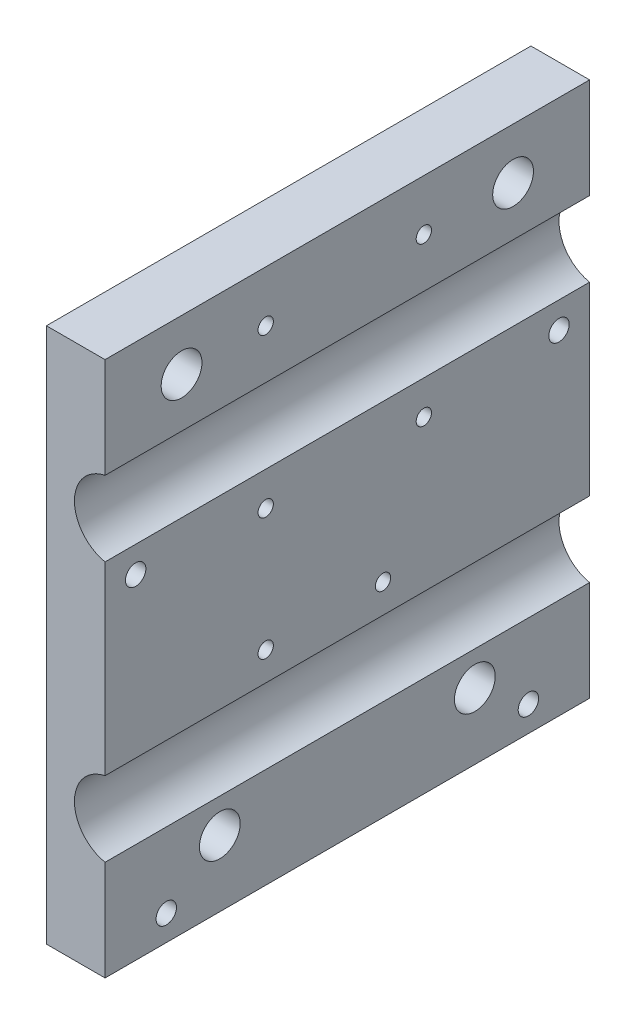
ISO-10303-21;
HEADER;
FILE_DESCRIPTION(('STEP AP214'),'2;1');
FILE_NAME('part.step','',(''),(''),'','','');
FILE_SCHEMA(('AUTOMOTIVE_DESIGN { 1 0 10303 214 1 1 1 1 }'));
ENDSEC;
DATA;
#1=APPLICATION_CONTEXT('core data for automotive mechanical design processes');
#2=APPLICATION_PROTOCOL_DEFINITION('international standard','automotive_design',2000,#1);
#3=PRODUCT_CONTEXT('',#1,'mechanical');
#4=PRODUCT('Part','Part','',(#3));
#5=PRODUCT_RELATED_PRODUCT_CATEGORY('part','',(#4));
#6=PRODUCT_DEFINITION_FORMATION('','',#4);
#7=PRODUCT_DEFINITION_CONTEXT('part definition',#1,'design');
#8=PRODUCT_DEFINITION('design','',#6,#7);
#9=PRODUCT_DEFINITION_SHAPE('','',#8);
#10=(LENGTH_UNIT() NAMED_UNIT(*) SI_UNIT(.MILLI.,.METRE.));
#11=(NAMED_UNIT(*) PLANE_ANGLE_UNIT() SI_UNIT($,.RADIAN.));
#12=(NAMED_UNIT(*) SI_UNIT($,.STERADIAN.) SOLID_ANGLE_UNIT());
#13=UNCERTAINTY_MEASURE_WITH_UNIT(LENGTH_MEASURE(1.E-05),#10,'distance_accuracy_value','');
#14=(GEOMETRIC_REPRESENTATION_CONTEXT(3) GLOBAL_UNCERTAINTY_ASSIGNED_CONTEXT((#13)) GLOBAL_UNIT_ASSIGNED_CONTEXT((#10,
#11,#12)) REPRESENTATION_CONTEXT('',''));
#15=CARTESIAN_POINT('',(0.,0.,0.));
#16=DIRECTION('',(0.,0.,1.));
#17=DIRECTION('',(1.,0.,0.));
#18=AXIS2_PLACEMENT_3D('',#15,#16,#17);
#19=CARTESIAN_POINT('',(-11.5,2.77555756156289E-13,95.0000000000002));
#20=DIRECTION('',(1.,0.,0.));
#21=DIRECTION('',(0.,0.,-1.));
#22=AXIS2_PLACEMENT_3D('',#19,#20,#21);
#23=PLANE('',#22);
#24=CARTESIAN_POINT('',(-11.4999999999995,-9.99999999999995,63.5000000000001));
#25=DIRECTION('',(1.,0.,0.));
#26=DIRECTION('',(0.,1.,0.));
#27=AXIS2_PLACEMENT_3D('',#24,#25,#26);
#28=CIRCLE('',#27,1.5);
#29=CARTESIAN_POINT('',(-11.4999999999995,-8.49999999999996,63.5000000000001));
#30=VERTEX_POINT('',#29);
#31=EDGE_CURVE('E229',#30,#30,#28,.T.);
#32=ORIENTED_EDGE('',*,*,#31,.T.);
#33=EDGE_LOOP('',(#32));
#34=FACE_BOUND('',#33,.T.);
#35=CARTESIAN_POINT('',(-11.4999999999995,-41.0000000000002,63.5000000000001));
#36=DIRECTION('',(1.,0.,0.));
#37=DIRECTION('',(0.,1.,0.));
#38=AXIS2_PLACEMENT_3D('',#35,#36,#37);
#39=CIRCLE('',#38,1.5);
#40=CARTESIAN_POINT('',(-11.4999999999995,-39.5000000000002,63.5000000000001));
#41=VERTEX_POINT('',#40);
#42=EDGE_CURVE('E254',#41,#41,#39,.T.);
#43=ORIENTED_EDGE('',*,*,#42,.T.);
#44=EDGE_LOOP('',(#43));
#45=FACE_BOUND('',#44,.T.);
#46=CARTESIAN_POINT('',(-11.4999999999995,-41.,32.5));
#47=DIRECTION('',(1.,0.,0.));
#48=DIRECTION('',(0.,1.,0.));
#49=AXIS2_PLACEMENT_3D('',#46,#47,#48);
#50=CIRCLE('',#49,1.5);
#51=CARTESIAN_POINT('',(-11.4999999999995,-39.5,32.5));
#52=VERTEX_POINT('',#51);
#53=EDGE_CURVE('E246',#52,#52,#50,.T.);
#54=ORIENTED_EDGE('',*,*,#53,.T.);
#55=EDGE_LOOP('',(#54));
#56=FACE_BOUND('',#55,.T.);
#57=CARTESIAN_POINT('',(-11.4999999999995,-65.,40.5));
#58=DIRECTION('',(1.,0.,0.));
#59=DIRECTION('',(0.,1.,0.));
#60=AXIS2_PLACEMENT_3D('',#57,#58,#59);
#61=CIRCLE('',#60,1.5);
#62=CARTESIAN_POINT('',(-11.4999999999995,-63.5,40.5));
#63=VERTEX_POINT('',#62);
#64=EDGE_CURVE('E237',#63,#63,#61,.T.);
#65=ORIENTED_EDGE('',*,*,#64,.T.);
#66=EDGE_LOOP('',(#65));
#67=FACE_BOUND('',#66,.T.);
#68=CARTESIAN_POINT('',(-11.4999999999995,-65.0000000000002,63.5));
#69=DIRECTION('',(1.,0.,0.));
#70=DIRECTION('',(0.,1.,0.));
#71=AXIS2_PLACEMENT_3D('',#68,#69,#70);
#72=CIRCLE('',#71,1.5);
#73=CARTESIAN_POINT('',(-11.4999999999995,-63.5000000000002,63.5));
#74=VERTEX_POINT('',#73);
#75=EDGE_CURVE('E238',#74,#74,#72,.T.);
#76=ORIENTED_EDGE('',*,*,#75,.T.);
#77=EDGE_LOOP('',(#76));
#78=FACE_BOUND('',#77,.T.);
#79=CARTESIAN_POINT('',(-11.4999999999995,-10.,32.5000000000001));
#80=DIRECTION('',(1.,0.,0.));
#81=DIRECTION('',(0.,1.,0.));
#82=AXIS2_PLACEMENT_3D('',#79,#80,#81);
#83=CIRCLE('',#82,1.5);
#84=CARTESIAN_POINT('',(-11.4999999999995,-8.50000000000001,32.5000000000001));
#85=VERTEX_POINT('',#84);
#86=EDGE_CURVE('E221',#85,#85,#83,.T.);
#87=ORIENTED_EDGE('',*,*,#86,.T.);
#88=EDGE_LOOP('',(#87));
#89=FACE_BOUND('',#88,.T.);
#90=CARTESIAN_POINT('',(-11.4999999999995,-92.0000000000001,72.5));
#91=DIRECTION('',(-1.,0.,0.));
#92=DIRECTION('',(0.,0.,1.));
#93=AXIS2_PLACEMENT_3D('',#90,#91,#92);
#94=CIRCLE('',#93,4.00000000000001);
#95=CARTESIAN_POINT('',(-11.4999999999995,-92.0000000000001,76.5));
#96=VERTEX_POINT('',#95);
#97=EDGE_CURVE('E210',#96,#96,#94,.T.);
#98=ORIENTED_EDGE('',*,*,#97,.F.);
#99=EDGE_LOOP('',(#98));
#100=FACE_BOUND('',#99,.T.);
#101=CARTESIAN_POINT('',(-11.4999999999994,-10.0000000000005,15.0000000000001));
#102=DIRECTION('',(-1.,0.,0.));
#103=DIRECTION('',(0.,0.,1.));
#104=AXIS2_PLACEMENT_3D('',#101,#102,#103);
#105=CIRCLE('',#104,4.00000000000001);
#106=CARTESIAN_POINT('',(-11.4999999999994,-10.0000000000005,19.0000000000001));
#107=VERTEX_POINT('',#106);
#108=EDGE_CURVE('E201',#107,#107,#105,.T.);
#109=ORIENTED_EDGE('',*,*,#108,.F.);
#110=EDGE_LOOP('',(#109));
#111=FACE_BOUND('',#110,.T.);
#112=CARTESIAN_POINT('',(-11.5,-92.0000000000003,22.5000000000001));
#113=DIRECTION('',(-1.,0.,0.));
#114=DIRECTION('',(0.,0.,1.));
#115=AXIS2_PLACEMENT_3D('',#112,#113,#114);
#116=CIRCLE('',#115,4.00000000000001);
#117=CARTESIAN_POINT('',(-11.5,-92.0000000000003,26.5000000000001));
#118=VERTEX_POINT('',#117);
#119=EDGE_CURVE('E217',#118,#118,#116,.T.);
#120=ORIENTED_EDGE('',*,*,#119,.F.);
#121=EDGE_LOOP('',(#120));
#122=FACE_BOUND('',#121,.T.);
#123=CARTESIAN_POINT('',(-11.5,-9.99999999999973,80.0000000000001));
#124=DIRECTION('',(-1.,0.,0.));
#125=DIRECTION('',(0.,0.,1.));
#126=AXIS2_PLACEMENT_3D('',#123,#124,#125);
#127=CIRCLE('',#126,4.00000000000001);
#128=CARTESIAN_POINT('',(-11.5,-9.99999999999973,84.0000000000001));
#129=VERTEX_POINT('',#128);
#130=EDGE_CURVE('E193',#129,#129,#127,.T.);
#131=ORIENTED_EDGE('',*,*,#130,.F.);
#132=EDGE_LOOP('',(#131));
#133=FACE_BOUND('',#132,.T.);
#134=CARTESIAN_POINT('',(-11.5,-39.4999999999999,6.00000000000006));
#135=DIRECTION('',(1.,0.,0.));
#136=DIRECTION('',(0.,1.,0.));
#137=AXIS2_PLACEMENT_3D('',#134,#135,#136);
#138=CIRCLE('',#137,2.);
#139=CARTESIAN_POINT('',(-11.5,-37.4999999999999,6.00000000000006));
#140=VERTEX_POINT('',#139);
#141=EDGE_CURVE('E164',#140,#140,#138,.T.);
#142=ORIENTED_EDGE('',*,*,#141,.T.);
#143=EDGE_LOOP('',(#142));
#144=FACE_BOUND('',#143,.T.);
#145=CARTESIAN_POINT('',(-11.5,-39.5,89.0000000000001));
#146=DIRECTION('',(1.,0.,0.));
#147=DIRECTION('',(0.,1.,0.));
#148=AXIS2_PLACEMENT_3D('',#145,#146,#147);
#149=CIRCLE('',#148,2.);
#150=CARTESIAN_POINT('',(-11.5,-37.5,89.0000000000001));
#151=VERTEX_POINT('',#150);
#152=EDGE_CURVE('E181',#151,#151,#149,.T.);
#153=ORIENTED_EDGE('',*,*,#152,.T.);
#154=EDGE_LOOP('',(#153));
#155=FACE_BOUND('',#154,.T.);
#156=CARTESIAN_POINT('',(-11.5,-99.9999999999998,12.));
#157=DIRECTION('',(1.,0.,0.));
#158=DIRECTION('',(0.,-1.,0.));
#159=AXIS2_PLACEMENT_3D('',#156,#157,#158);
#160=CIRCLE('',#159,2.);
#161=CARTESIAN_POINT('',(-11.5,-102.,12.));
#162=VERTEX_POINT('',#161);
#163=EDGE_CURVE('E172',#162,#162,#160,.T.);
#164=ORIENTED_EDGE('',*,*,#163,.T.);
#165=EDGE_LOOP('',(#164));
#166=FACE_BOUND('',#165,.T.);
#167=CARTESIAN_POINT('',(-11.4999999999995,-99.9999999999999,83.0000000000003));
#168=DIRECTION('',(1.,0.,0.));
#169=DIRECTION('',(0.,1.,0.));
#170=AXIS2_PLACEMENT_3D('',#167,#168,#169);
#171=CIRCLE('',#170,2.);
#172=CARTESIAN_POINT('',(-11.4999999999995,-97.9999999999999,83.0000000000003));
#173=VERTEX_POINT('',#172);
#174=EDGE_CURVE('E163',#173,#173,#171,.T.);
#175=ORIENTED_EDGE('',*,*,#174,.T.);
#176=EDGE_LOOP('',(#175));
#177=FACE_BOUND('',#176,.T.);
#178=DIRECTION('',(0.,-1.,0.));
#179=VECTOR('',#178,1.);
#180=CARTESIAN_POINT('',(-11.5,0.,0.));
#181=LINE('',#180,#179);
#182=CARTESIAN_POINT('',(-11.5,0.,0.));
#183=VERTEX_POINT('',#182);
#184=CARTESIAN_POINT('',(-11.5,-105.,0.));
#185=VERTEX_POINT('',#184);
#186=EDGE_CURVE('E176',#183,#185,#181,.T.);
#187=ORIENTED_EDGE('',*,*,#186,.T.);
#188=DIRECTION('',(0.,0.,-1.));
#189=VECTOR('',#188,1.);
#190=CARTESIAN_POINT('',(-11.4999999999995,-105.,95.0000000000002));
#191=LINE('',#190,#189);
#192=CARTESIAN_POINT('',(-11.4999999999995,-105.,95.0000000000002));
#193=VERTEX_POINT('',#192);
#194=EDGE_CURVE('E11',#193,#185,#191,.T.);
#195=ORIENTED_EDGE('',*,*,#194,.F.);
#196=DIRECTION('',(0.,-1.,0.));
#197=VECTOR('',#196,1.);
#198=CARTESIAN_POINT('',(-11.5,2.77555756156289E-13,95.0000000000002));
#199=LINE('',#198,#197);
#200=CARTESIAN_POINT('',(-11.5,2.77555756156289E-13,95.0000000000002));
#201=VERTEX_POINT('',#200);
#202=EDGE_CURVE('E156',#201,#193,#199,.T.);
#203=ORIENTED_EDGE('',*,*,#202,.F.);
#204=DIRECTION('',(0.,0.,-1.));
#205=VECTOR('',#204,1.);
#206=CARTESIAN_POINT('',(-11.5,2.77555756156289E-13,95.0000000000002));
#207=LINE('',#206,#205);
#208=EDGE_CURVE('E138',#201,#183,#207,.T.);
#209=ORIENTED_EDGE('',*,*,#208,.T.);
#210=EDGE_LOOP('',(#187,#195,#203,#209));
#211=FACE_BOUND('',#210,.T.);
#212=ADVANCED_FACE('F41',(#34,#45,#56,#67,#78,#89,#100,#111,#122,#133,#144,#155,#166,#177,#211),
#23,.F.);
#213=CARTESIAN_POINT('',(5.55111512312578E-13,-105.,95.));
#214=DIRECTION('',(0.,1.,0.));
#215=DIRECTION('',(0.,0.,1.));
#216=AXIS2_PLACEMENT_3D('',#213,#214,#215);
#217=PLANE('',#216);
#218=DIRECTION('',(1.,0.,0.));
#219=VECTOR('',#218,1.);
#220=CARTESIAN_POINT('',(0.,-105.,0.));
#221=LINE('',#220,#219);
#222=CARTESIAN_POINT('',(0.,-105.,0.));
#223=VERTEX_POINT('',#222);
#224=EDGE_CURVE('E333',#185,#223,#221,.T.);
#225=ORIENTED_EDGE('',*,*,#224,.T.);
#226=DIRECTION('',(0.,0.,-1.));
#227=VECTOR('',#226,1.);
#228=CARTESIAN_POINT('',(5.55111512312578E-13,-105.,95.));
#229=LINE('',#228,#227);
#230=CARTESIAN_POINT('',(5.55111512312578E-13,-105.,95.));
#231=VERTEX_POINT('',#230);
#232=EDGE_CURVE('E50',#231,#223,#229,.T.);
#233=ORIENTED_EDGE('',*,*,#232,.F.);
#234=DIRECTION('',(1.,0.,0.));
#235=VECTOR('',#234,1.);
#236=CARTESIAN_POINT('',(5.55111512312578E-13,-105.,95.));
#237=LINE('',#236,#235);
#238=EDGE_CURVE('E97',#193,#231,#237,.T.);
#239=ORIENTED_EDGE('',*,*,#238,.F.);
#240=ORIENTED_EDGE('',*,*,#194,.T.);
#241=EDGE_LOOP('',(#225,#233,#239,#240));
#242=FACE_BOUND('',#241,.T.);
#243=ADVANCED_FACE('F334',(#242),#217,.F.);
#244=CARTESIAN_POINT('',(0.,2.77555756156289E-13,95.));
#245=DIRECTION('',(1.,0.,0.));
#246=DIRECTION('',(0.,1.,0.));
#247=AXIS2_PLACEMENT_3D('',#244,#245,#246);
#248=PLANE('',#247);
#249=CARTESIAN_POINT('',(5.55111512312578E-13,-92.0000000000001,72.5));
#250=DIRECTION('',(-1.,0.,0.));
#251=DIRECTION('',(0.,0.,1.));
#252=AXIS2_PLACEMENT_3D('',#249,#250,#251);
#253=CIRCLE('',#252,4.00000000000001);
#254=CARTESIAN_POINT('',(5.55111512312578E-13,-92.0000000000001,76.5));
#255=VERTEX_POINT('',#254);
#256=EDGE_CURVE('E197',#255,#255,#253,.T.);
#257=ORIENTED_EDGE('',*,*,#256,.T.);
#258=EDGE_LOOP('',(#257));
#259=FACE_BOUND('',#258,.T.);
#260=CARTESIAN_POINT('',(0.,-92.0000000000003,22.5));
#261=DIRECTION('',(-1.,0.,0.));
#262=DIRECTION('',(0.,0.,1.));
#263=AXIS2_PLACEMENT_3D('',#260,#261,#262);
#264=CIRCLE('',#263,4.00000000000001);
#265=CARTESIAN_POINT('',(0.,-92.0000000000003,26.5));
#266=VERTEX_POINT('',#265);
#267=EDGE_CURVE('E206',#266,#266,#264,.T.);
#268=ORIENTED_EDGE('',*,*,#267,.T.);
#269=EDGE_LOOP('',(#268));
#270=FACE_BOUND('',#269,.T.);
#271=CARTESIAN_POINT('',(0.,-99.9999999999998,12.));
#272=DIRECTION('',(1.,0.,0.));
#273=DIRECTION('',(0.,-1.,0.));
#274=AXIS2_PLACEMENT_3D('',#271,#272,#273);
#275=CIRCLE('',#274,2.);
#276=CARTESIAN_POINT('',(0.,-102.,12.));
#277=VERTEX_POINT('',#276);
#278=EDGE_CURVE('E168',#277,#277,#275,.T.);
#279=ORIENTED_EDGE('',*,*,#278,.F.);
#280=EDGE_LOOP('',(#279));
#281=FACE_BOUND('',#280,.T.);
#282=CARTESIAN_POINT('',(5.55111512312578E-13,-99.9999999999999,83.));
#283=DIRECTION('',(1.,0.,0.));
#284=DIRECTION('',(0.,1.,0.));
#285=AXIS2_PLACEMENT_3D('',#282,#283,#284);
#286=CIRCLE('',#285,2.);
#287=CARTESIAN_POINT('',(5.53731443413912E-13,-97.9999999999999,83.));
#288=VERTEX_POINT('',#287);
#289=EDGE_CURVE('E159',#288,#288,#286,.T.);
#290=ORIENTED_EDGE('',*,*,#289,.F.);
#291=EDGE_LOOP('',(#290));
#292=FACE_BOUND('',#291,.T.);
#293=DIRECTION('',(0.,-1.,0.));
#294=VECTOR('',#293,1.);
#295=CARTESIAN_POINT('',(0.,0.,0.));
#296=LINE('',#295,#294);
#297=CARTESIAN_POINT('',(0.,-85.3484692283494,0.));
#298=VERTEX_POINT('',#297);
#299=EDGE_CURVE('E331',#298,#223,#296,.T.);
#300=ORIENTED_EDGE('',*,*,#299,.F.);
#301=DIRECTION('',(0.,0.,-1.));
#302=VECTOR('',#301,1.);
#303=CARTESIAN_POINT('',(5.55111512312578E-13,-85.3484692283495,95.));
#304=LINE('',#303,#302);
#305=CARTESIAN_POINT('',(5.55111512312578E-13,-85.3484692283495,95.));
#306=VERTEX_POINT('',#305);
#307=EDGE_CURVE('E322',#306,#298,#304,.T.);
#308=ORIENTED_EDGE('',*,*,#307,.F.);
#309=DIRECTION('',(0.,-1.,0.));
#310=VECTOR('',#309,1.);
#311=CARTESIAN_POINT('',(0.,2.77555756156289E-13,95.));
#312=LINE('',#311,#310);
#313=EDGE_CURVE('E147',#306,#231,#312,.T.);
#314=ORIENTED_EDGE('',*,*,#313,.T.);
#315=ORIENTED_EDGE('',*,*,#232,.T.);
#316=EDGE_LOOP('',(#300,#308,#314,#315));
#317=FACE_BOUND('',#316,.T.);
#318=ADVANCED_FACE('F329',(#259,#270,#281,#292,#317),#248,.T.);
#319=CARTESIAN_POINT('',(1.5000000000005,-78.,95.));
#320=DIRECTION('',(0.,0.,-1.));
#321=DIRECTION('',(-1.,0.,0.));
#322=AXIS2_PLACEMENT_3D('',#319,#320,#321);
#323=CYLINDRICAL_SURFACE('',#322,7.50000000000002);
#324=CARTESIAN_POINT('',(1.50000000000006,-77.9999999999998,0.));
#325=DIRECTION('',(0.,0.,1.));
#326=DIRECTION('',(1.,0.,0.));
#327=AXIS2_PLACEMENT_3D('',#324,#325,#326);
#328=CIRCLE('',#327,7.50000000000002);
#329=CARTESIAN_POINT('',(0.,-70.6515307716503,0.));
#330=VERTEX_POINT('',#329);
#331=EDGE_CURVE('E301',#330,#298,#328,.T.);
#332=ORIENTED_EDGE('',*,*,#331,.F.);
#333=DIRECTION('',(0.,0.,-1.));
#334=VECTOR('',#333,1.);
#335=CARTESIAN_POINT('',(5.55111512312578E-13,-70.6515307716504,95.));
#336=LINE('',#335,#334);
#337=CARTESIAN_POINT('',(5.55111512312578E-13,-70.6515307716504,95.));
#338=VERTEX_POINT('',#337);
#339=EDGE_CURVE('E296',#338,#330,#336,.T.);
#340=ORIENTED_EDGE('',*,*,#339,.F.);
#341=CARTESIAN_POINT('',(1.5000000000005,-78.,95.));
#342=DIRECTION('',(0.,0.,1.));
#343=DIRECTION('',(1.,0.,0.));
#344=AXIS2_PLACEMENT_3D('',#341,#342,#343);
#345=CIRCLE('',#344,7.50000000000002);
#346=EDGE_CURVE('E142',#338,#306,#345,.T.);
#347=ORIENTED_EDGE('',*,*,#346,.T.);
#348=ORIENTED_EDGE('',*,*,#307,.T.);
#349=EDGE_LOOP('',(#332,#340,#347,#348));
#350=FACE_BOUND('',#349,.T.);
#351=ADVANCED_FACE('F287',(#350),#323,.F.);
#352=CARTESIAN_POINT('',(0.,2.77555756156289E-13,95.));
#353=DIRECTION('',(1.,0.,0.));
#354=DIRECTION('',(0.,1.,0.));
#355=AXIS2_PLACEMENT_3D('',#352,#353,#354);
#356=PLANE('',#355);
#357=CARTESIAN_POINT('',(5.55111512312578E-13,-41.0000000000002,63.5));
#358=DIRECTION('',(1.,0.,0.));
#359=DIRECTION('',(0.,1.,0.));
#360=AXIS2_PLACEMENT_3D('',#357,#358,#359);
#361=CIRCLE('',#360,1.5);
#362=CARTESIAN_POINT('',(5.54278845044109E-13,-39.5000000000002,63.5));
#363=VERTEX_POINT('',#362);
#364=EDGE_CURVE('E250',#363,#363,#361,.T.);
#365=ORIENTED_EDGE('',*,*,#364,.F.);
#366=EDGE_LOOP('',(#365));
#367=FACE_BOUND('',#366,.T.);
#368=CARTESIAN_POINT('',(5.55111512312578E-13,-40.9999999999999,32.5));
#369=DIRECTION('',(1.,0.,0.));
#370=DIRECTION('',(0.,1.,0.));
#371=AXIS2_PLACEMENT_3D('',#368,#369,#370);
#372=CIRCLE('',#371,1.5);
#373=CARTESIAN_POINT('',(5.54278845044109E-13,-39.4999999999999,32.5));
#374=VERTEX_POINT('',#373);
#375=EDGE_CURVE('E242',#374,#374,#372,.T.);
#376=ORIENTED_EDGE('',*,*,#375,.F.);
#377=EDGE_LOOP('',(#376));
#378=FACE_BOUND('',#377,.T.);
#379=CARTESIAN_POINT('',(5.55111512312578E-13,-65.,40.5));
#380=DIRECTION('',(1.,0.,0.));
#381=DIRECTION('',(0.,1.,0.));
#382=AXIS2_PLACEMENT_3D('',#379,#380,#381);
#383=CIRCLE('',#382,1.5);
#384=CARTESIAN_POINT('',(5.54278845044109E-13,-63.5,40.5));
#385=VERTEX_POINT('',#384);
#386=EDGE_CURVE('E233',#385,#385,#383,.T.);
#387=ORIENTED_EDGE('',*,*,#386,.F.);
#388=EDGE_LOOP('',(#387));
#389=FACE_BOUND('',#388,.T.);
#390=CARTESIAN_POINT('',(5.55111512312578E-13,-65.0000000000002,63.5));
#391=DIRECTION('',(1.,0.,0.));
#392=DIRECTION('',(0.,1.,0.));
#393=AXIS2_PLACEMENT_3D('',#390,#391,#392);
#394=CIRCLE('',#393,1.5);
#395=CARTESIAN_POINT('',(5.54278845044109E-13,-63.5000000000002,63.5));
#396=VERTEX_POINT('',#395);
#397=EDGE_CURVE('E265',#396,#396,#394,.T.);
#398=ORIENTED_EDGE('',*,*,#397,.F.);
#399=EDGE_LOOP('',(#398));
#400=FACE_BOUND('',#399,.T.);
#401=CARTESIAN_POINT('',(0.,-39.4999999999999,6.00000000000001));
#402=DIRECTION('',(1.,0.,0.));
#403=DIRECTION('',(0.,1.,0.));
#404=AXIS2_PLACEMENT_3D('',#401,#402,#403);
#405=CIRCLE('',#404,2.);
#406=CARTESIAN_POINT('',(0.,-37.4999999999999,6.00000000000001));
#407=VERTEX_POINT('',#406);
#408=EDGE_CURVE('E186',#407,#407,#405,.T.);
#409=ORIENTED_EDGE('',*,*,#408,.F.);
#410=EDGE_LOOP('',(#409));
#411=FACE_BOUND('',#410,.T.);
#412=CARTESIAN_POINT('',(5.55111512312578E-13,-39.5,89.));
#413=DIRECTION('',(1.,0.,0.));
#414=DIRECTION('',(0.,1.,0.));
#415=AXIS2_PLACEMENT_3D('',#412,#413,#414);
#416=CIRCLE('',#415,2.);
#417=CARTESIAN_POINT('',(5.53731443413912E-13,-37.5,89.));
#418=VERTEX_POINT('',#417);
#419=EDGE_CURVE('E177',#418,#418,#416,.T.);
#420=ORIENTED_EDGE('',*,*,#419,.F.);
#421=EDGE_LOOP('',(#420));
#422=FACE_BOUND('',#421,.T.);
#423=DIRECTION('',(0.,-1.,0.));
#424=VECTOR('',#423,1.);
#425=CARTESIAN_POINT('',(0.,0.,0.));
#426=LINE('',#425,#424);
#427=CARTESIAN_POINT('',(0.,-34.3484692283494,0.));
#428=VERTEX_POINT('',#427);
#429=EDGE_CURVE('E295',#428,#330,#426,.T.);
#430=ORIENTED_EDGE('',*,*,#429,.F.);
#431=DIRECTION('',(0.,0.,-1.));
#432=VECTOR('',#431,1.);
#433=CARTESIAN_POINT('',(0.,-34.3484692283495,95.));
#434=LINE('',#433,#432);
#435=CARTESIAN_POINT('',(0.,-34.3484692283495,95.));
#436=VERTEX_POINT('',#435);
#437=EDGE_CURVE('E123',#436,#428,#434,.T.);
#438=ORIENTED_EDGE('',*,*,#437,.F.);
#439=DIRECTION('',(0.,-1.,0.));
#440=VECTOR('',#439,1.);
#441=CARTESIAN_POINT('',(0.,2.77555756156289E-13,95.));
#442=LINE('',#441,#440);
#443=EDGE_CURVE('E130',#436,#338,#442,.T.);
#444=ORIENTED_EDGE('',*,*,#443,.T.);
#445=ORIENTED_EDGE('',*,*,#339,.T.);
#446=EDGE_LOOP('',(#430,#438,#444,#445));
#447=FACE_BOUND('',#446,.T.);
#448=ADVANCED_FACE('F284',(#367,#378,#389,#400,#411,#422,#447),#356,.T.);
#449=CARTESIAN_POINT('',(1.50000000000006,-26.9999999999997,95.));
#450=DIRECTION('',(0.,0.,-1.));
#451=DIRECTION('',(-1.,0.,0.));
#452=AXIS2_PLACEMENT_3D('',#449,#450,#451);
#453=CYLINDRICAL_SURFACE('',#452,7.5);
#454=CARTESIAN_POINT('',(1.50000000000006,-27.,0.));
#455=DIRECTION('',(0.,0.,1.));
#456=DIRECTION('',(1.,0.,0.));
#457=AXIS2_PLACEMENT_3D('',#454,#455,#456);
#458=CIRCLE('',#457,7.5);
#459=CARTESIAN_POINT('',(0.,-19.6515307716505,0.));
#460=VERTEX_POINT('',#459);
#461=EDGE_CURVE('E117',#460,#428,#458,.T.);
#462=ORIENTED_EDGE('',*,*,#461,.F.);
#463=DIRECTION('',(0.,0.,-1.));
#464=VECTOR('',#463,1.);
#465=CARTESIAN_POINT('',(0.,-19.6515307716502,95.));
#466=LINE('',#465,#464);
#467=CARTESIAN_POINT('',(0.,-19.6515307716502,95.));
#468=VERTEX_POINT('',#467);
#469=EDGE_CURVE('E112',#468,#460,#466,.T.);
#470=ORIENTED_EDGE('',*,*,#469,.F.);
#471=CARTESIAN_POINT('',(1.50000000000006,-26.9999999999997,95.));
#472=DIRECTION('',(0.,0.,1.));
#473=DIRECTION('',(1.,0.,0.));
#474=AXIS2_PLACEMENT_3D('',#471,#472,#473);
#475=CIRCLE('',#474,7.5);
#476=EDGE_CURVE('E115',#468,#436,#475,.T.);
#477=ORIENTED_EDGE('',*,*,#476,.T.);
#478=ORIENTED_EDGE('',*,*,#437,.T.);
#479=EDGE_LOOP('',(#462,#470,#477,#478));
#480=FACE_BOUND('',#479,.T.);
#481=ADVANCED_FACE('F114',(#480),#453,.F.);
#482=CARTESIAN_POINT('',(5.55111512312578E-13,-9.99999999999995,63.5));
#483=DIRECTION('',(1.,0.,0.));
#484=DIRECTION('',(0.,1.,0.));
#485=AXIS2_PLACEMENT_3D('',#482,#483,#484);
#486=CIRCLE('',#485,1.5);
#487=CARTESIAN_POINT('',(5.54278845044109E-13,-8.49999999999996,63.5));
#488=VERTEX_POINT('',#487);
#489=EDGE_CURVE('E258',#488,#488,#486,.T.);
#490=ORIENTED_EDGE('',*,*,#489,.F.);
#491=EDGE_LOOP('',(#490));
#492=FACE_BOUND('',#491,.T.);
#493=CARTESIAN_POINT('',(5.55111512312578E-13,-10.,32.5000000000001));
#494=DIRECTION('',(1.,0.,0.));
#495=DIRECTION('',(0.,1.,0.));
#496=AXIS2_PLACEMENT_3D('',#493,#494,#495);
#497=CIRCLE('',#496,1.5);
#498=CARTESIAN_POINT('',(5.54278845044109E-13,-8.50000000000001,32.5000000000001));
#499=VERTEX_POINT('',#498);
#500=EDGE_CURVE('E225',#499,#499,#497,.T.);
#501=ORIENTED_EDGE('',*,*,#500,.F.);
#502=EDGE_LOOP('',(#501));
#503=FACE_BOUND('',#502,.T.);
#504=CARTESIAN_POINT('',(5.55111512312578E-13,-10.0000000000005,15.0000000000001));
#505=DIRECTION('',(-1.,0.,0.));
#506=DIRECTION('',(0.,0.,1.));
#507=AXIS2_PLACEMENT_3D('',#504,#505,#506);
#508=CIRCLE('',#507,4.00000000000001);
#509=CARTESIAN_POINT('',(5.55111512312578E-13,-10.0000000000005,19.0000000000001));
#510=VERTEX_POINT('',#509);
#511=EDGE_CURVE('E205',#510,#510,#508,.T.);
#512=ORIENTED_EDGE('',*,*,#511,.T.);
#513=EDGE_LOOP('',(#512));
#514=FACE_BOUND('',#513,.T.);
#515=CARTESIAN_POINT('',(1.11022302462516E-13,-9.99999999999973,80.));
#516=DIRECTION('',(-1.,0.,0.));
#517=DIRECTION('',(0.,0.,1.));
#518=AXIS2_PLACEMENT_3D('',#515,#516,#517);
#519=CIRCLE('',#518,4.00000000000001);
#520=CARTESIAN_POINT('',(1.11022302462516E-13,-9.99999999999973,84.));
#521=VERTEX_POINT('',#520);
#522=EDGE_CURVE('E182',#521,#521,#519,.T.);
#523=ORIENTED_EDGE('',*,*,#522,.T.);
#524=EDGE_LOOP('',(#523));
#525=FACE_BOUND('',#524,.T.);
#526=CARTESIAN_POINT('',(0.,0.,0.));
#527=VERTEX_POINT('',#526);
#528=EDGE_CURVE('E303',#527,#460,#426,.T.);
#529=ORIENTED_EDGE('',*,*,#528,.F.);
#530=DIRECTION('',(0.,0.,-1.));
#531=VECTOR('',#530,1.);
#532=CARTESIAN_POINT('',(0.,2.77555756156289E-13,95.));
#533=LINE('',#532,#531);
#534=CARTESIAN_POINT('',(0.,2.77555756156289E-13,95.));
#535=VERTEX_POINT('',#534);
#536=EDGE_CURVE('E86',#535,#527,#533,.T.);
#537=ORIENTED_EDGE('',*,*,#536,.F.);
#538=EDGE_CURVE('E127',#535,#468,#442,.T.);
#539=ORIENTED_EDGE('',*,*,#538,.T.);
#540=ORIENTED_EDGE('',*,*,#469,.T.);
#541=EDGE_LOOP('',(#529,#537,#539,#540));
#542=FACE_BOUND('',#541,.T.);
#543=ADVANCED_FACE('F133',(#492,#503,#514,#525,#542),#356,.T.);
#544=CARTESIAN_POINT('',(0.,2.77555756156289E-13,95.));
#545=DIRECTION('',(0.,-1.,0.));
#546=DIRECTION('',(1.,0.,0.));
#547=AXIS2_PLACEMENT_3D('',#544,#545,#546);
#548=PLANE('',#547);
#549=DIRECTION('',(-1.,0.,0.));
#550=VECTOR('',#549,1.);
#551=CARTESIAN_POINT('',(0.,0.,0.));
#552=LINE('',#551,#550);
#553=EDGE_CURVE('E89',#527,#183,#552,.T.);
#554=ORIENTED_EDGE('',*,*,#553,.T.);
#555=ORIENTED_EDGE('',*,*,#208,.F.);
#556=DIRECTION('',(-1.,0.,0.));
#557=VECTOR('',#556,1.);
#558=CARTESIAN_POINT('',(0.,2.77555756156289E-13,95.));
#559=LINE('',#558,#557);
#560=EDGE_CURVE('E58',#535,#201,#559,.T.);
#561=ORIENTED_EDGE('',*,*,#560,.F.);
#562=ORIENTED_EDGE('',*,*,#536,.T.);
#563=EDGE_LOOP('',(#554,#555,#561,#562));
#564=FACE_BOUND('',#563,.T.);
#565=ADVANCED_FACE('F348',(#564),#548,.F.);
#566=CARTESIAN_POINT('',(0.,2.77555756156289E-13,95.));
#567=DIRECTION('',(0.,0.,1.));
#568=DIRECTION('',(1.,0.,0.));
#569=AXIS2_PLACEMENT_3D('',#566,#567,#568);
#570=PLANE('',#569);
#571=ORIENTED_EDGE('',*,*,#202,.T.);
#572=ORIENTED_EDGE('',*,*,#238,.T.);
#573=ORIENTED_EDGE('',*,*,#313,.F.);
#574=ORIENTED_EDGE('',*,*,#346,.F.);
#575=ORIENTED_EDGE('',*,*,#443,.F.);
#576=ORIENTED_EDGE('',*,*,#476,.F.);
#577=ORIENTED_EDGE('',*,*,#538,.F.);
#578=ORIENTED_EDGE('',*,*,#560,.T.);
#579=EDGE_LOOP('',(#571,#572,#573,#574,#575,#576,#577,#578));
#580=FACE_BOUND('',#579,.T.);
#581=ADVANCED_FACE('F126',(#580),#570,.T.);
#582=CARTESIAN_POINT('',(0.,0.,0.));
#583=DIRECTION('',(0.,0.,1.));
#584=DIRECTION('',(1.,0.,0.));
#585=AXIS2_PLACEMENT_3D('',#582,#583,#584);
#586=PLANE('',#585);
#587=ORIENTED_EDGE('',*,*,#186,.F.);
#588=ORIENTED_EDGE('',*,*,#553,.F.);
#589=ORIENTED_EDGE('',*,*,#528,.T.);
#590=ORIENTED_EDGE('',*,*,#461,.T.);
#591=ORIENTED_EDGE('',*,*,#429,.T.);
#592=ORIENTED_EDGE('',*,*,#331,.T.);
#593=ORIENTED_EDGE('',*,*,#299,.T.);
#594=ORIENTED_EDGE('',*,*,#224,.F.);
#595=EDGE_LOOP('',(#587,#588,#589,#590,#591,#592,#593,#594));
#596=FACE_BOUND('',#595,.T.);
#597=ADVANCED_FACE('F305',(#596),#586,.F.);
#598=CARTESIAN_POINT('',(-11.4999999999995,-99.9999999999999,83.0000000000003));
#599=DIRECTION('',(1.,0.,0.));
#600=DIRECTION('',(0.,1.,0.));
#601=AXIS2_PLACEMENT_3D('',#598,#599,#600);
#602=CYLINDRICAL_SURFACE('',#601,2.);
#603=ORIENTED_EDGE('',*,*,#174,.F.);
#604=EDGE_LOOP('',(#603));
#605=FACE_BOUND('',#604,.T.);
#606=ORIENTED_EDGE('',*,*,#289,.T.);
#607=EDGE_LOOP('',(#606));
#608=FACE_BOUND('',#607,.T.);
#609=ADVANCED_FACE('F416',(#605,#608),#602,.F.);
#610=CARTESIAN_POINT('',(-11.5,-99.9999999999998,12.));
#611=DIRECTION('',(1.,0.,0.));
#612=DIRECTION('',(0.,1.,0.));
#613=AXIS2_PLACEMENT_3D('',#610,#611,#612);
#614=CYLINDRICAL_SURFACE('',#613,2.);
#615=ORIENTED_EDGE('',*,*,#163,.F.);
#616=EDGE_LOOP('',(#615));
#617=FACE_BOUND('',#616,.T.);
#618=ORIENTED_EDGE('',*,*,#278,.T.);
#619=EDGE_LOOP('',(#618));
#620=FACE_BOUND('',#619,.T.);
#621=ADVANCED_FACE('F412',(#617,#620),#614,.F.);
#622=CARTESIAN_POINT('',(-11.5,-39.5,89.0000000000001));
#623=DIRECTION('',(1.,0.,0.));
#624=DIRECTION('',(0.,1.,0.));
#625=AXIS2_PLACEMENT_3D('',#622,#623,#624);
#626=CYLINDRICAL_SURFACE('',#625,2.);
#627=ORIENTED_EDGE('',*,*,#152,.F.);
#628=EDGE_LOOP('',(#627));
#629=FACE_BOUND('',#628,.T.);
#630=ORIENTED_EDGE('',*,*,#419,.T.);
#631=EDGE_LOOP('',(#630));
#632=FACE_BOUND('',#631,.T.);
#633=ADVANCED_FACE('F408',(#629,#632),#626,.F.);
#634=CARTESIAN_POINT('',(-11.5,-39.4999999999999,6.00000000000006));
#635=DIRECTION('',(1.,0.,0.));
#636=DIRECTION('',(0.,1.,0.));
#637=AXIS2_PLACEMENT_3D('',#634,#635,#636);
#638=CYLINDRICAL_SURFACE('',#637,2.);
#639=ORIENTED_EDGE('',*,*,#141,.F.);
#640=EDGE_LOOP('',(#639));
#641=FACE_BOUND('',#640,.T.);
#642=ORIENTED_EDGE('',*,*,#408,.T.);
#643=EDGE_LOOP('',(#642));
#644=FACE_BOUND('',#643,.T.);
#645=ADVANCED_FACE('F404',(#641,#644),#638,.F.);
#646=CARTESIAN_POINT('',(1.11022302462516E-13,-9.99999999999973,80.));
#647=DIRECTION('',(-1.,0.,0.));
#648=DIRECTION('',(0.,0.,1.));
#649=AXIS2_PLACEMENT_3D('',#646,#647,#648);
#650=CYLINDRICAL_SURFACE('',#649,4.00000000000001);
#651=ORIENTED_EDGE('',*,*,#522,.F.);
#652=EDGE_LOOP('',(#651));
#653=FACE_BOUND('',#652,.T.);
#654=ORIENTED_EDGE('',*,*,#130,.T.);
#655=EDGE_LOOP('',(#654));
#656=FACE_BOUND('',#655,.T.);
#657=ADVANCED_FACE('F400',(#653,#656),#650,.F.);
#658=CARTESIAN_POINT('',(5.55111512312578E-13,-10.0000000000005,15.0000000000001));
#659=DIRECTION('',(-1.,0.,0.));
#660=DIRECTION('',(0.,0.,1.));
#661=AXIS2_PLACEMENT_3D('',#658,#659,#660);
#662=CYLINDRICAL_SURFACE('',#661,4.00000000000001);
#663=ORIENTED_EDGE('',*,*,#511,.F.);
#664=EDGE_LOOP('',(#663));
#665=FACE_BOUND('',#664,.T.);
#666=ORIENTED_EDGE('',*,*,#108,.T.);
#667=EDGE_LOOP('',(#666));
#668=FACE_BOUND('',#667,.T.);
#669=ADVANCED_FACE('F393',(#665,#668),#662,.F.);
#670=CARTESIAN_POINT('',(0.,-92.0000000000003,22.5));
#671=DIRECTION('',(-1.,0.,0.));
#672=DIRECTION('',(0.,0.,1.));
#673=AXIS2_PLACEMENT_3D('',#670,#671,#672);
#674=CYLINDRICAL_SURFACE('',#673,4.00000000000001);
#675=ORIENTED_EDGE('',*,*,#267,.F.);
#676=EDGE_LOOP('',(#675));
#677=FACE_BOUND('',#676,.T.);
#678=ORIENTED_EDGE('',*,*,#119,.T.);
#679=EDGE_LOOP('',(#678));
#680=FACE_BOUND('',#679,.T.);
#681=ADVANCED_FACE('F390',(#677,#680),#674,.F.);
#682=CARTESIAN_POINT('',(5.55111512312578E-13,-92.0000000000001,72.5));
#683=DIRECTION('',(-1.,0.,0.));
#684=DIRECTION('',(0.,0.,1.));
#685=AXIS2_PLACEMENT_3D('',#682,#683,#684);
#686=CYLINDRICAL_SURFACE('',#685,4.00000000000001);
#687=ORIENTED_EDGE('',*,*,#256,.F.);
#688=EDGE_LOOP('',(#687));
#689=FACE_BOUND('',#688,.T.);
#690=ORIENTED_EDGE('',*,*,#97,.T.);
#691=EDGE_LOOP('',(#690));
#692=FACE_BOUND('',#691,.T.);
#693=ADVANCED_FACE('F388',(#689,#692),#686,.F.);
#694=CARTESIAN_POINT('',(-11.4999999999995,-10.,32.5000000000001));
#695=DIRECTION('',(1.,0.,0.));
#696=DIRECTION('',(0.,1.,0.));
#697=AXIS2_PLACEMENT_3D('',#694,#695,#696);
#698=CYLINDRICAL_SURFACE('',#697,1.5);
#699=ORIENTED_EDGE('',*,*,#86,.F.);
#700=EDGE_LOOP('',(#699));
#701=FACE_BOUND('',#700,.T.);
#702=ORIENTED_EDGE('',*,*,#500,.T.);
#703=EDGE_LOOP('',(#702));
#704=FACE_BOUND('',#703,.T.);
#705=ADVANCED_FACE('F385',(#701,#704),#698,.F.);
#706=CARTESIAN_POINT('',(-11.4999999999995,-9.99999999999995,63.5000000000001));
#707=DIRECTION('',(1.,0.,0.));
#708=DIRECTION('',(0.,1.,0.));
#709=AXIS2_PLACEMENT_3D('',#706,#707,#708);
#710=CYLINDRICAL_SURFACE('',#709,1.5);
#711=ORIENTED_EDGE('',*,*,#31,.F.);
#712=EDGE_LOOP('',(#711));
#713=FACE_BOUND('',#712,.T.);
#714=ORIENTED_EDGE('',*,*,#489,.T.);
#715=EDGE_LOOP('',(#714));
#716=FACE_BOUND('',#715,.T.);
#717=ADVANCED_FACE('F280',(#713,#716),#710,.F.);
#718=CARTESIAN_POINT('',(-11.4999999999995,-65.0000000000002,63.5));
#719=DIRECTION('',(1.,0.,0.));
#720=DIRECTION('',(0.,1.,0.));
#721=AXIS2_PLACEMENT_3D('',#718,#719,#720);
#722=CYLINDRICAL_SURFACE('',#721,1.5);
#723=ORIENTED_EDGE('',*,*,#75,.F.);
#724=EDGE_LOOP('',(#723));
#725=FACE_BOUND('',#724,.T.);
#726=ORIENTED_EDGE('',*,*,#397,.T.);
#727=EDGE_LOOP('',(#726));
#728=FACE_BOUND('',#727,.T.);
#729=ADVANCED_FACE('F276',(#725,#728),#722,.F.);
#730=CARTESIAN_POINT('',(-11.4999999999995,-65.,40.5));
#731=DIRECTION('',(1.,0.,0.));
#732=DIRECTION('',(0.,1.,0.));
#733=AXIS2_PLACEMENT_3D('',#730,#731,#732);
#734=CYLINDRICAL_SURFACE('',#733,1.5);
#735=ORIENTED_EDGE('',*,*,#64,.F.);
#736=EDGE_LOOP('',(#735));
#737=FACE_BOUND('',#736,.T.);
#738=ORIENTED_EDGE('',*,*,#386,.T.);
#739=EDGE_LOOP('',(#738));
#740=FACE_BOUND('',#739,.T.);
#741=ADVANCED_FACE('F279',(#737,#740),#734,.F.);
#742=CARTESIAN_POINT('',(-11.4999999999995,-41.,32.5));
#743=DIRECTION('',(1.,0.,0.));
#744=DIRECTION('',(0.,1.,0.));
#745=AXIS2_PLACEMENT_3D('',#742,#743,#744);
#746=CYLINDRICAL_SURFACE('',#745,1.5);
#747=ORIENTED_EDGE('',*,*,#53,.F.);
#748=EDGE_LOOP('',(#747));
#749=FACE_BOUND('',#748,.T.);
#750=ORIENTED_EDGE('',*,*,#375,.T.);
#751=EDGE_LOOP('',(#750));
#752=FACE_BOUND('',#751,.T.);
#753=ADVANCED_FACE('F373',(#749,#752),#746,.F.);
#754=CARTESIAN_POINT('',(-11.4999999999995,-41.0000000000002,63.5000000000001));
#755=DIRECTION('',(1.,0.,0.));
#756=DIRECTION('',(0.,1.,0.));
#757=AXIS2_PLACEMENT_3D('',#754,#755,#756);
#758=CYLINDRICAL_SURFACE('',#757,1.5);
#759=ORIENTED_EDGE('',*,*,#42,.F.);
#760=EDGE_LOOP('',(#759));
#761=FACE_BOUND('',#760,.T.);
#762=ORIENTED_EDGE('',*,*,#364,.T.);
#763=EDGE_LOOP('',(#762));
#764=FACE_BOUND('',#763,.T.);
#765=ADVANCED_FACE('F380',(#761,#764),#758,.F.);
#766=CLOSED_SHELL('',(#212,#243,#318,#351,#448,#481,#543,#565,#581,#597,#609,#621,#633,#645,
#657,#669,#681,#693,#705,#717,#729,#741,#753,#765));
#767=MANIFOLD_SOLID_BREP('B2',#766);
#768=ADVANCED_BREP_SHAPE_REPRESENTATION('',(#18,#767),#14);
#769=SHAPE_DEFINITION_REPRESENTATION(#9,#768);
ENDSEC;
END-ISO-10303-21;
